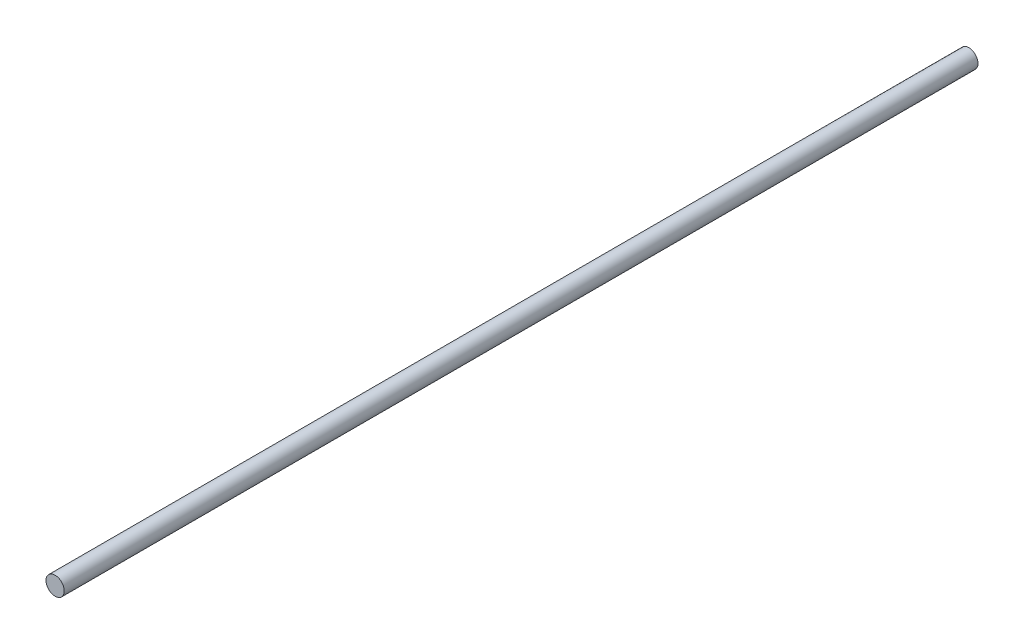
ISO-10303-21;
HEADER;
FILE_DESCRIPTION(('STEP AP214'),'2;1');
FILE_NAME('part.step','',(''),(''),'','','');
FILE_SCHEMA(('AUTOMOTIVE_DESIGN { 1 0 10303 214 1 1 1 1 }'));
ENDSEC;
DATA;
#1=APPLICATION_CONTEXT('core data for automotive mechanical design processes');
#2=APPLICATION_PROTOCOL_DEFINITION('international standard','automotive_design',2000,#1);
#3=PRODUCT_CONTEXT('',#1,'mechanical');
#4=PRODUCT('Part','Part','',(#3));
#5=PRODUCT_RELATED_PRODUCT_CATEGORY('part','',(#4));
#6=PRODUCT_DEFINITION_FORMATION('','',#4);
#7=PRODUCT_DEFINITION_CONTEXT('part definition',#1,'design');
#8=PRODUCT_DEFINITION('design','',#6,#7);
#9=PRODUCT_DEFINITION_SHAPE('','',#8);
#10=(LENGTH_UNIT() NAMED_UNIT(*) SI_UNIT(.MILLI.,.METRE.));
#11=(NAMED_UNIT(*) PLANE_ANGLE_UNIT() SI_UNIT($,.RADIAN.));
#12=(NAMED_UNIT(*) SI_UNIT($,.STERADIAN.) SOLID_ANGLE_UNIT());
#13=UNCERTAINTY_MEASURE_WITH_UNIT(LENGTH_MEASURE(1.E-05),#10,'distance_accuracy_value','');
#14=(GEOMETRIC_REPRESENTATION_CONTEXT(3) GLOBAL_UNCERTAINTY_ASSIGNED_CONTEXT((#13)) GLOBAL_UNIT_ASSIGNED_CONTEXT((#10,
#11,#12)) REPRESENTATION_CONTEXT('',''));
#15=CARTESIAN_POINT('',(0.,0.,0.));
#16=DIRECTION('',(0.,0.,1.));
#17=DIRECTION('',(1.,0.,0.));
#18=AXIS2_PLACEMENT_3D('',#15,#16,#17);
#19=CARTESIAN_POINT('',(0.,0.,150.));
#20=DIRECTION('',(0.,0.,-1.));
#21=DIRECTION('',(-1.,0.,0.));
#22=AXIS2_PLACEMENT_3D('',#19,#20,#21);
#23=CYLINDRICAL_SURFACE('',#22,1.);
#24=CARTESIAN_POINT('',(0.,0.,0.));
#25=DIRECTION('',(0.,0.,1.));
#26=DIRECTION('',(1.,0.,0.));
#27=AXIS2_PLACEMENT_3D('',#24,#25,#26);
#28=CIRCLE('',#27,1.);
#29=CARTESIAN_POINT('',(1.,0.,0.));
#30=VERTEX_POINT('',#29);
#31=EDGE_CURVE('E10',#30,#30,#28,.T.);
#32=ORIENTED_EDGE('',*,*,#31,.T.);
#33=EDGE_LOOP('',(#32));
#34=FACE_BOUND('',#33,.T.);
#35=CARTESIAN_POINT('',(0.,0.,100.));
#36=DIRECTION('',(0.,0.,1.));
#37=DIRECTION('',(1.,0.,0.));
#38=AXIS2_PLACEMENT_3D('',#35,#36,#37);
#39=CIRCLE('',#38,1.);
#40=CARTESIAN_POINT('',(1.,0.,100.));
#41=VERTEX_POINT('',#40);
#42=EDGE_CURVE('E42',#41,#41,#39,.T.);
#43=ORIENTED_EDGE('',*,*,#42,.F.);
#44=EDGE_LOOP('',(#43));
#45=FACE_BOUND('',#44,.T.);
#46=ADVANCED_FACE('F36',(#34,#45),#23,.T.);
#47=CARTESIAN_POINT('',(0.,0.,0.));
#48=DIRECTION('',(0.,0.,1.));
#49=DIRECTION('',(1.,0.,0.));
#50=AXIS2_PLACEMENT_3D('',#47,#48,#49);
#51=PLANE('',#50);
#52=ORIENTED_EDGE('',*,*,#31,.F.);
#53=EDGE_LOOP('',(#52));
#54=FACE_BOUND('',#53,.T.);
#55=ADVANCED_FACE('F51',(#54),#51,.F.);
#56=CARTESIAN_POINT('',(0.,0.,100.));
#57=DIRECTION('',(0.,0.,1.));
#58=DIRECTION('',(1.,0.,0.));
#59=AXIS2_PLACEMENT_3D('',#56,#57,#58);
#60=PLANE('',#59);
#61=ORIENTED_EDGE('',*,*,#42,.T.);
#62=EDGE_LOOP('',(#61));
#63=FACE_BOUND('',#62,.T.);
#64=ADVANCED_FACE('F48',(#63),#60,.T.);
#65=CLOSED_SHELL('',(#46,#55,#64));
#66=MANIFOLD_SOLID_BREP('B2',#65);
#67=ADVANCED_BREP_SHAPE_REPRESENTATION('',(#18,#66),#14);
#68=SHAPE_DEFINITION_REPRESENTATION(#9,#67);
ENDSEC;
END-ISO-10303-21;
